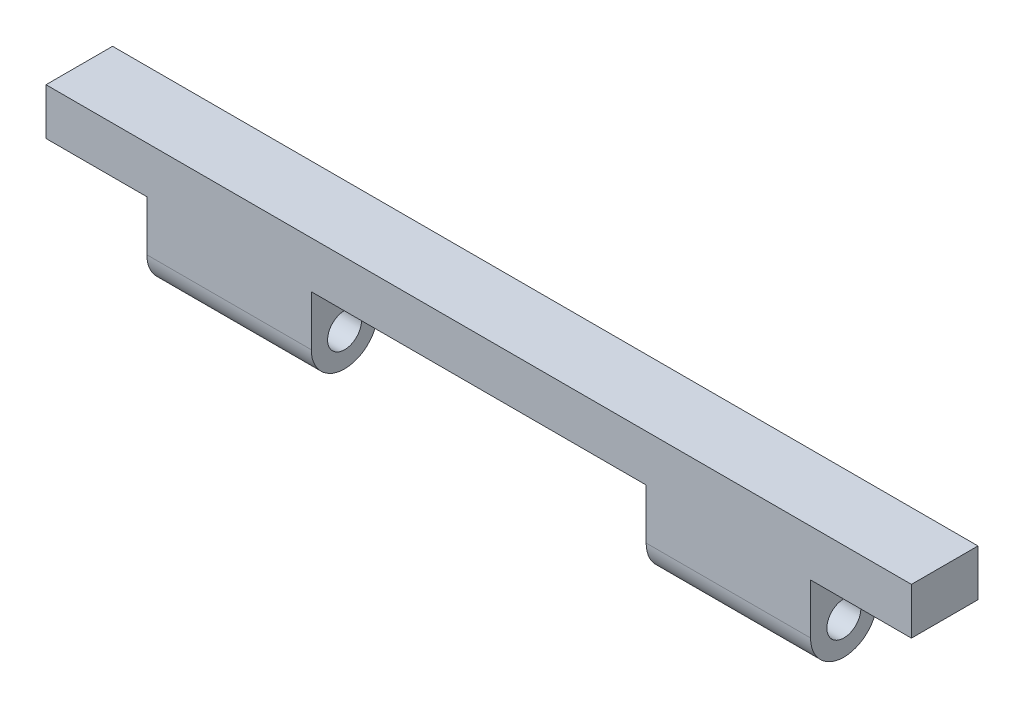
ISO-10303-21;
HEADER;
FILE_DESCRIPTION(('STEP AP214'),'2;1');
FILE_NAME('part.step','',(''),(''),'','','');
FILE_SCHEMA(('AUTOMOTIVE_DESIGN { 1 0 10303 214 1 1 1 1 }'));
ENDSEC;
DATA;
#1=APPLICATION_CONTEXT('core data for automotive mechanical design processes');
#2=APPLICATION_PROTOCOL_DEFINITION('international standard','automotive_design',2000,#1);
#3=PRODUCT_CONTEXT('',#1,'mechanical');
#4=PRODUCT('Part','Part','',(#3));
#5=PRODUCT_RELATED_PRODUCT_CATEGORY('part','',(#4));
#6=PRODUCT_DEFINITION_FORMATION('','',#4);
#7=PRODUCT_DEFINITION_CONTEXT('part definition',#1,'design');
#8=PRODUCT_DEFINITION('design','',#6,#7);
#9=PRODUCT_DEFINITION_SHAPE('','',#8);
#10=(LENGTH_UNIT() NAMED_UNIT(*) SI_UNIT(.MILLI.,.METRE.));
#11=(NAMED_UNIT(*) PLANE_ANGLE_UNIT() SI_UNIT($,.RADIAN.));
#12=(NAMED_UNIT(*) SI_UNIT($,.STERADIAN.) SOLID_ANGLE_UNIT());
#13=UNCERTAINTY_MEASURE_WITH_UNIT(LENGTH_MEASURE(1.E-05),#10,'distance_accuracy_value','');
#14=(GEOMETRIC_REPRESENTATION_CONTEXT(3) GLOBAL_UNCERTAINTY_ASSIGNED_CONTEXT((#13)) GLOBAL_UNIT_ASSIGNED_CONTEXT((#10,
#11,#12)) REPRESENTATION_CONTEXT('',''));
#15=CARTESIAN_POINT('',(0.,0.,0.));
#16=DIRECTION('',(0.,0.,1.));
#17=DIRECTION('',(1.,0.,0.));
#18=AXIS2_PLACEMENT_3D('',#15,#16,#17);
#19=CARTESIAN_POINT('',(25.15,0.,5.));
#20=DIRECTION('',(-1.,0.,0.));
#21=DIRECTION('',(0.,0.,1.));
#22=AXIS2_PLACEMENT_3D('',#19,#20,#21);
#23=PLANE('',#22);
#24=CARTESIAN_POINT('',(25.15,-5.95,0.));
#25=DIRECTION('',(-1.,0.,0.));
#26=DIRECTION('',(0.,0.,1.));
#27=AXIS2_PLACEMENT_3D('',#24,#25,#26);
#28=CIRCLE('',#27,2.55);
#29=CARTESIAN_POINT('',(25.15,-5.95,2.55));
#30=VERTEX_POINT('',#29);
#31=EDGE_CURVE('E186',#30,#30,#28,.T.);
#32=ORIENTED_EDGE('',*,*,#31,.F.);
#33=EDGE_LOOP('',(#32));
#34=FACE_BOUND('',#33,.T.);
#35=CARTESIAN_POINT('',(25.15,-6.,0.));
#36=DIRECTION('',(-1.,0.,0.));
#37=DIRECTION('',(0.,0.,1.));
#38=AXIS2_PLACEMENT_3D('',#35,#36,#37);
#39=CIRCLE('',#38,5.);
#40=CARTESIAN_POINT('',(25.15,-6.,-5.));
#41=VERTEX_POINT('',#40);
#42=CARTESIAN_POINT('',(25.15,-11.,0.));
#43=VERTEX_POINT('',#42);
#44=EDGE_CURVE('E53',#41,#43,#39,.T.);
#45=ORIENTED_EDGE('',*,*,#44,.T.);
#46=CARTESIAN_POINT('',(25.15,-6.,0.));
#47=DIRECTION('',(-1.,0.,0.));
#48=DIRECTION('',(0.,0.,1.));
#49=AXIS2_PLACEMENT_3D('',#46,#47,#48);
#50=CIRCLE('',#49,5.);
#51=CARTESIAN_POINT('',(25.15,-6.,5.));
#52=VERTEX_POINT('',#51);
#53=EDGE_CURVE('E246',#43,#52,#50,.T.);
#54=ORIENTED_EDGE('',*,*,#53,.T.);
#55=DIRECTION('',(0.,1.,0.));
#56=VECTOR('',#55,1.);
#57=CARTESIAN_POINT('',(25.15,0.,5.));
#58=LINE('',#57,#56);
#59=CARTESIAN_POINT('',(25.15,1.55,5.));
#60=VERTEX_POINT('',#59);
#61=EDGE_CURVE('E149',#52,#60,#58,.T.);
#62=ORIENTED_EDGE('',*,*,#61,.T.);
#63=DIRECTION('',(0.,0.,-1.));
#64=VECTOR('',#63,1.);
#65=CARTESIAN_POINT('',(25.15,1.55,5.));
#66=LINE('',#65,#64);
#67=CARTESIAN_POINT('',(25.15,1.55,-5.));
#68=VERTEX_POINT('',#67);
#69=EDGE_CURVE('E183',#60,#68,#66,.T.);
#70=ORIENTED_EDGE('',*,*,#69,.T.);
#71=DIRECTION('',(0.,1.,0.));
#72=VECTOR('',#71,1.);
#73=CARTESIAN_POINT('',(25.15,0.,-5.));
#74=LINE('',#73,#72);
#75=EDGE_CURVE('E184',#41,#68,#74,.T.);
#76=ORIENTED_EDGE('',*,*,#75,.F.);
#77=EDGE_LOOP('',(#45,#54,#62,#70,#76));
#78=FACE_BOUND('',#77,.T.);
#79=ADVANCED_FACE('F36',(#34,#78),#23,.T.);
#80=CARTESIAN_POINT('',(49.85,0.,5.));
#81=DIRECTION('',(-1.,0.,0.));
#82=DIRECTION('',(0.,0.,1.));
#83=AXIS2_PLACEMENT_3D('',#80,#81,#82);
#84=PLANE('',#83);
#85=CARTESIAN_POINT('',(49.85,-5.95,0.));
#86=DIRECTION('',(-1.,0.,0.));
#87=DIRECTION('',(0.,0.,1.));
#88=AXIS2_PLACEMENT_3D('',#85,#86,#87);
#89=CIRCLE('',#88,2.55);
#90=CARTESIAN_POINT('',(49.85,-5.95,2.55));
#91=VERTEX_POINT('',#90);
#92=EDGE_CURVE('E474',#91,#91,#89,.T.);
#93=ORIENTED_EDGE('',*,*,#92,.T.);
#94=EDGE_LOOP('',(#93));
#95=FACE_BOUND('',#94,.T.);
#96=DIRECTION('',(0.,1.,0.));
#97=VECTOR('',#96,1.);
#98=CARTESIAN_POINT('',(49.85,0.,5.));
#99=LINE('',#98,#97);
#100=CARTESIAN_POINT('',(49.85,-6.,5.));
#101=VERTEX_POINT('',#100);
#102=CARTESIAN_POINT('',(49.85,1.55,5.));
#103=VERTEX_POINT('',#102);
#104=EDGE_CURVE('E139',#101,#103,#99,.T.);
#105=ORIENTED_EDGE('',*,*,#104,.F.);
#106=CARTESIAN_POINT('',(49.85,-6.,0.));
#107=DIRECTION('',(-1.,0.,0.));
#108=DIRECTION('',(0.,0.,1.));
#109=AXIS2_PLACEMENT_3D('',#106,#107,#108);
#110=CIRCLE('',#109,5.);
#111=CARTESIAN_POINT('',(49.85,-11.,0.));
#112=VERTEX_POINT('',#111);
#113=EDGE_CURVE('E243',#101,#112,#110,.F.);
#114=ORIENTED_EDGE('',*,*,#113,.T.);
#115=CARTESIAN_POINT('',(49.85,-6.,0.));
#116=DIRECTION('',(-1.,0.,0.));
#117=DIRECTION('',(0.,0.,1.));
#118=AXIS2_PLACEMENT_3D('',#115,#116,#117);
#119=CIRCLE('',#118,5.);
#120=CARTESIAN_POINT('',(49.85,-6.,-5.));
#121=VERTEX_POINT('',#120);
#122=EDGE_CURVE('E241',#112,#121,#119,.F.);
#123=ORIENTED_EDGE('',*,*,#122,.T.);
#124=DIRECTION('',(0.,1.,0.));
#125=VECTOR('',#124,1.);
#126=CARTESIAN_POINT('',(49.85,0.,-5.));
#127=LINE('',#126,#125);
#128=CARTESIAN_POINT('',(49.85,1.55,-5.));
#129=VERTEX_POINT('',#128);
#130=EDGE_CURVE('E154',#121,#129,#127,.T.);
#131=ORIENTED_EDGE('',*,*,#130,.T.);
#132=DIRECTION('',(0.,0.,-1.));
#133=VECTOR('',#132,1.);
#134=CARTESIAN_POINT('',(49.85,1.55,5.));
#135=LINE('',#134,#133);
#136=EDGE_CURVE('E152',#103,#129,#135,.T.);
#137=ORIENTED_EDGE('',*,*,#136,.F.);
#138=EDGE_LOOP('',(#105,#114,#123,#131,#137));
#139=FACE_BOUND('',#138,.T.);
#140=ADVANCED_FACE('F153',(#95,#139),#84,.F.);
#141=CARTESIAN_POINT('',(0.,1.55,5.));
#142=DIRECTION('',(0.,-1.,0.));
#143=DIRECTION('',(0.,0.,-1.));
#144=AXIS2_PLACEMENT_3D('',#141,#142,#143);
#145=PLANE('',#144);
#146=DIRECTION('',(-1.,0.,0.));
#147=VECTOR('',#146,1.);
#148=CARTESIAN_POINT('',(0.,1.55,-5.));
#149=LINE('',#148,#147);
#150=CARTESIAN_POINT('',(65.,1.55,-5.));
#151=VERTEX_POINT('',#150);
#152=EDGE_CURVE('E188',#151,#129,#149,.T.);
#153=ORIENTED_EDGE('',*,*,#152,.F.);
#154=DIRECTION('',(0.,0.,-1.));
#155=VECTOR('',#154,1.);
#156=CARTESIAN_POINT('',(65.,1.55,5.));
#157=LINE('',#156,#155);
#158=CARTESIAN_POINT('',(65.,1.55,5.));
#159=VERTEX_POINT('',#158);
#160=EDGE_CURVE('E158',#159,#151,#157,.T.);
#161=ORIENTED_EDGE('',*,*,#160,.F.);
#162=DIRECTION('',(-1.,0.,0.));
#163=VECTOR('',#162,1.);
#164=CARTESIAN_POINT('',(0.,1.55,5.));
#165=LINE('',#164,#163);
#166=EDGE_CURVE('E144',#159,#103,#165,.T.);
#167=ORIENTED_EDGE('',*,*,#166,.T.);
#168=ORIENTED_EDGE('',*,*,#136,.T.);
#169=EDGE_LOOP('',(#153,#161,#167,#168));
#170=FACE_BOUND('',#169,.T.);
#171=ADVANCED_FACE('F160',(#170),#145,.T.);
#172=CARTESIAN_POINT('',(65.,0.,5.));
#173=DIRECTION('',(-1.,0.,0.));
#174=DIRECTION('',(0.,0.,1.));
#175=AXIS2_PLACEMENT_3D('',#172,#173,#174);
#176=PLANE('',#175);
#177=DIRECTION('',(0.,1.,0.));
#178=VECTOR('',#177,1.);
#179=CARTESIAN_POINT('',(65.,0.,-5.));
#180=LINE('',#179,#178);
#181=CARTESIAN_POINT('',(65.,8.55,-5.));
#182=VERTEX_POINT('',#181);
#183=EDGE_CURVE('E190',#151,#182,#180,.T.);
#184=ORIENTED_EDGE('',*,*,#183,.T.);
#185=DIRECTION('',(0.,0.,-1.));
#186=VECTOR('',#185,1.);
#187=CARTESIAN_POINT('',(65.,8.55,5.));
#188=LINE('',#187,#186);
#189=CARTESIAN_POINT('',(65.,8.55,5.));
#190=VERTEX_POINT('',#189);
#191=EDGE_CURVE('E221',#190,#182,#188,.T.);
#192=ORIENTED_EDGE('',*,*,#191,.F.);
#193=DIRECTION('',(0.,1.,0.));
#194=VECTOR('',#193,1.);
#195=CARTESIAN_POINT('',(65.,0.,5.));
#196=LINE('',#195,#194);
#197=EDGE_CURVE('E162',#159,#190,#196,.T.);
#198=ORIENTED_EDGE('',*,*,#197,.F.);
#199=ORIENTED_EDGE('',*,*,#160,.T.);
#200=EDGE_LOOP('',(#184,#192,#198,#199));
#201=FACE_BOUND('',#200,.T.);
#202=ADVANCED_FACE('F264',(#201),#176,.F.);
#203=CARTESIAN_POINT('',(0.,8.55,5.));
#204=DIRECTION('',(0.,1.,0.));
#205=DIRECTION('',(0.,0.,1.));
#206=AXIS2_PLACEMENT_3D('',#203,#204,#205);
#207=PLANE('',#206);
#208=DIRECTION('',(1.,0.,0.));
#209=VECTOR('',#208,1.);
#210=CARTESIAN_POINT('',(0.,8.55,-5.));
#211=LINE('',#210,#209);
#212=CARTESIAN_POINT('',(-65.,8.55,-5.));
#213=VERTEX_POINT('',#212);
#214=EDGE_CURVE('E193',#213,#182,#211,.T.);
#215=ORIENTED_EDGE('',*,*,#214,.F.);
#216=DIRECTION('',(0.,0.,-1.));
#217=VECTOR('',#216,1.);
#218=CARTESIAN_POINT('',(-65.,8.55,5.));
#219=LINE('',#218,#217);
#220=CARTESIAN_POINT('',(-65.,8.55,5.));
#221=VERTEX_POINT('',#220);
#222=EDGE_CURVE('E219',#221,#213,#219,.T.);
#223=ORIENTED_EDGE('',*,*,#222,.F.);
#224=DIRECTION('',(1.,0.,0.));
#225=VECTOR('',#224,1.);
#226=CARTESIAN_POINT('',(0.,8.55,5.));
#227=LINE('',#226,#225);
#228=EDGE_CURVE('E164',#221,#190,#227,.T.);
#229=ORIENTED_EDGE('',*,*,#228,.T.);
#230=ORIENTED_EDGE('',*,*,#191,.T.);
#231=EDGE_LOOP('',(#215,#223,#229,#230));
#232=FACE_BOUND('',#231,.T.);
#233=ADVANCED_FACE('F402',(#232),#207,.T.);
#234=CARTESIAN_POINT('',(-65.,0.,5.));
#235=DIRECTION('',(-1.,0.,0.));
#236=DIRECTION('',(0.,0.,1.));
#237=AXIS2_PLACEMENT_3D('',#234,#235,#236);
#238=PLANE('',#237);
#239=DIRECTION('',(0.,1.,0.));
#240=VECTOR('',#239,1.);
#241=CARTESIAN_POINT('',(-65.,0.,-5.));
#242=LINE('',#241,#240);
#243=CARTESIAN_POINT('',(-65.,1.55,-5.));
#244=VERTEX_POINT('',#243);
#245=EDGE_CURVE('E196',#244,#213,#242,.T.);
#246=ORIENTED_EDGE('',*,*,#245,.F.);
#247=DIRECTION('',(0.,0.,-1.));
#248=VECTOR('',#247,1.);
#249=CARTESIAN_POINT('',(-65.,1.55,5.));
#250=LINE('',#249,#248);
#251=CARTESIAN_POINT('',(-65.,1.55,5.));
#252=VERTEX_POINT('',#251);
#253=EDGE_CURVE('E217',#252,#244,#250,.T.);
#254=ORIENTED_EDGE('',*,*,#253,.F.);
#255=DIRECTION('',(0.,1.,0.));
#256=VECTOR('',#255,1.);
#257=CARTESIAN_POINT('',(-65.,0.,5.));
#258=LINE('',#257,#256);
#259=EDGE_CURVE('E170',#252,#221,#258,.T.);
#260=ORIENTED_EDGE('',*,*,#259,.T.);
#261=ORIENTED_EDGE('',*,*,#222,.T.);
#262=EDGE_LOOP('',(#246,#254,#260,#261));
#263=FACE_BOUND('',#262,.T.);
#264=ADVANCED_FACE('F271',(#263),#238,.T.);
#265=CARTESIAN_POINT('',(0.,1.55000000000001,5.));
#266=DIRECTION('',(0.,-1.,0.));
#267=DIRECTION('',(1.,0.,0.));
#268=AXIS2_PLACEMENT_3D('',#265,#266,#267);
#269=PLANE('',#268);
#270=DIRECTION('',(-1.,0.,0.));
#271=VECTOR('',#270,1.);
#272=CARTESIAN_POINT('',(0.,1.55000000000001,-5.));
#273=LINE('',#272,#271);
#274=CARTESIAN_POINT('',(-49.85,1.55,-5.));
#275=VERTEX_POINT('',#274);
#276=EDGE_CURVE('E199',#275,#244,#273,.T.);
#277=ORIENTED_EDGE('',*,*,#276,.F.);
#278=DIRECTION('',(0.,0.,-1.));
#279=VECTOR('',#278,1.);
#280=CARTESIAN_POINT('',(-49.85,1.55,5.));
#281=LINE('',#280,#279);
#282=CARTESIAN_POINT('',(-49.85,1.55,5.));
#283=VERTEX_POINT('',#282);
#284=EDGE_CURVE('E214',#283,#275,#281,.T.);
#285=ORIENTED_EDGE('',*,*,#284,.F.);
#286=DIRECTION('',(-1.,0.,0.));
#287=VECTOR('',#286,1.);
#288=CARTESIAN_POINT('',(0.,1.55000000000001,5.));
#289=LINE('',#288,#287);
#290=EDGE_CURVE('E173',#283,#252,#289,.T.);
#291=ORIENTED_EDGE('',*,*,#290,.T.);
#292=ORIENTED_EDGE('',*,*,#253,.T.);
#293=EDGE_LOOP('',(#277,#285,#291,#292));
#294=FACE_BOUND('',#293,.T.);
#295=ADVANCED_FACE('F274',(#294),#269,.T.);
#296=CARTESIAN_POINT('',(-49.85,0.,5.));
#297=DIRECTION('',(-1.,0.,0.));
#298=DIRECTION('',(0.,0.,1.));
#299=AXIS2_PLACEMENT_3D('',#296,#297,#298);
#300=PLANE('',#299);
#301=CARTESIAN_POINT('',(-49.85,-5.95,0.));
#302=DIRECTION('',(-1.,0.,0.));
#303=DIRECTION('',(0.,0.,1.));
#304=AXIS2_PLACEMENT_3D('',#301,#302,#303);
#305=CIRCLE('',#304,2.55);
#306=CARTESIAN_POINT('',(-49.85,-5.95,2.55));
#307=VERTEX_POINT('',#306);
#308=EDGE_CURVE('E227',#307,#307,#305,.T.);
#309=ORIENTED_EDGE('',*,*,#308,.F.);
#310=EDGE_LOOP('',(#309));
#311=FACE_BOUND('',#310,.T.);
#312=CARTESIAN_POINT('',(-49.85,-6.,0.));
#313=DIRECTION('',(-1.,0.,0.));
#314=DIRECTION('',(0.,0.,1.));
#315=AXIS2_PLACEMENT_3D('',#312,#313,#314);
#316=CIRCLE('',#315,5.);
#317=CARTESIAN_POINT('',(-49.85,-6.,-5.));
#318=VERTEX_POINT('',#317);
#319=CARTESIAN_POINT('',(-49.85,-11.,0.));
#320=VERTEX_POINT('',#319);
#321=EDGE_CURVE('E237',#318,#320,#316,.T.);
#322=ORIENTED_EDGE('',*,*,#321,.T.);
#323=CARTESIAN_POINT('',(-49.85,-6.,0.));
#324=DIRECTION('',(-1.,0.,0.));
#325=DIRECTION('',(0.,0.,1.));
#326=AXIS2_PLACEMENT_3D('',#323,#324,#325);
#327=CIRCLE('',#326,5.);
#328=CARTESIAN_POINT('',(-49.85,-6.,5.));
#329=VERTEX_POINT('',#328);
#330=EDGE_CURVE('E239',#320,#329,#327,.T.);
#331=ORIENTED_EDGE('',*,*,#330,.T.);
#332=DIRECTION('',(0.,1.,0.));
#333=VECTOR('',#332,1.);
#334=CARTESIAN_POINT('',(-49.85,0.,5.));
#335=LINE('',#334,#333);
#336=EDGE_CURVE('E176',#329,#283,#335,.T.);
#337=ORIENTED_EDGE('',*,*,#336,.T.);
#338=ORIENTED_EDGE('',*,*,#284,.T.);
#339=DIRECTION('',(0.,1.,0.));
#340=VECTOR('',#339,1.);
#341=CARTESIAN_POINT('',(-49.85,0.,-5.));
#342=LINE('',#341,#340);
#343=EDGE_CURVE('E202',#318,#275,#342,.T.);
#344=ORIENTED_EDGE('',*,*,#343,.F.);
#345=EDGE_LOOP('',(#322,#331,#337,#338,#344));
#346=FACE_BOUND('',#345,.T.);
#347=ADVANCED_FACE('F289',(#311,#346),#300,.T.);
#348=CARTESIAN_POINT('',(-25.15,0.,5.));
#349=DIRECTION('',(-1.,0.,0.));
#350=DIRECTION('',(0.,0.,1.));
#351=AXIS2_PLACEMENT_3D('',#348,#349,#350);
#352=PLANE('',#351);
#353=CARTESIAN_POINT('',(-25.15,-5.95,0.));
#354=DIRECTION('',(-1.,0.,0.));
#355=DIRECTION('',(0.,0.,1.));
#356=AXIS2_PLACEMENT_3D('',#353,#354,#355);
#357=CIRCLE('',#356,2.55);
#358=CARTESIAN_POINT('',(-25.15,-5.95,2.55));
#359=VERTEX_POINT('',#358);
#360=EDGE_CURVE('E224',#359,#359,#357,.T.);
#361=ORIENTED_EDGE('',*,*,#360,.T.);
#362=EDGE_LOOP('',(#361));
#363=FACE_BOUND('',#362,.T.);
#364=DIRECTION('',(0.,1.,0.));
#365=VECTOR('',#364,1.);
#366=CARTESIAN_POINT('',(-25.15,0.,5.));
#367=LINE('',#366,#365);
#368=CARTESIAN_POINT('',(-25.15,-6.,5.));
#369=VERTEX_POINT('',#368);
#370=CARTESIAN_POINT('',(-25.15,1.55,5.));
#371=VERTEX_POINT('',#370);
#372=EDGE_CURVE('E178',#369,#371,#367,.T.);
#373=ORIENTED_EDGE('',*,*,#372,.F.);
#374=CARTESIAN_POINT('',(-25.15,-6.,0.));
#375=DIRECTION('',(-1.,0.,0.));
#376=DIRECTION('',(0.,0.,1.));
#377=AXIS2_PLACEMENT_3D('',#374,#375,#376);
#378=CIRCLE('',#377,5.);
#379=CARTESIAN_POINT('',(-25.15,-11.,0.));
#380=VERTEX_POINT('',#379);
#381=EDGE_CURVE('E235',#369,#380,#378,.F.);
#382=ORIENTED_EDGE('',*,*,#381,.T.);
#383=CARTESIAN_POINT('',(-25.15,-6.,0.));
#384=DIRECTION('',(-1.,0.,0.));
#385=DIRECTION('',(0.,0.,1.));
#386=AXIS2_PLACEMENT_3D('',#383,#384,#385);
#387=CIRCLE('',#386,5.);
#388=CARTESIAN_POINT('',(-25.15,-6.,-5.));
#389=VERTEX_POINT('',#388);
#390=EDGE_CURVE('E233',#380,#389,#387,.F.);
#391=ORIENTED_EDGE('',*,*,#390,.T.);
#392=DIRECTION('',(0.,1.,0.));
#393=VECTOR('',#392,1.);
#394=CARTESIAN_POINT('',(-25.15,0.,-5.));
#395=LINE('',#394,#393);
#396=CARTESIAN_POINT('',(-25.15,1.55,-5.));
#397=VERTEX_POINT('',#396);
#398=EDGE_CURVE('E204',#389,#397,#395,.T.);
#399=ORIENTED_EDGE('',*,*,#398,.T.);
#400=DIRECTION('',(0.,0.,-1.));
#401=VECTOR('',#400,1.);
#402=CARTESIAN_POINT('',(-25.15,1.55,5.));
#403=LINE('',#402,#401);
#404=EDGE_CURVE('E211',#371,#397,#403,.T.);
#405=ORIENTED_EDGE('',*,*,#404,.F.);
#406=EDGE_LOOP('',(#373,#382,#391,#399,#405));
#407=FACE_BOUND('',#406,.T.);
#408=ADVANCED_FACE('F282',(#363,#407),#352,.F.);
#409=CARTESIAN_POINT('',(0.,1.55,5.));
#410=DIRECTION('',(0.,-1.,0.));
#411=DIRECTION('',(0.,0.,-1.));
#412=AXIS2_PLACEMENT_3D('',#409,#410,#411);
#413=PLANE('',#412);
#414=DIRECTION('',(-1.,0.,0.));
#415=VECTOR('',#414,1.);
#416=CARTESIAN_POINT('',(0.,1.55,-5.));
#417=LINE('',#416,#415);
#418=EDGE_CURVE('E206',#68,#397,#417,.T.);
#419=ORIENTED_EDGE('',*,*,#418,.F.);
#420=ORIENTED_EDGE('',*,*,#69,.F.);
#421=DIRECTION('',(-1.,0.,0.));
#422=VECTOR('',#421,1.);
#423=CARTESIAN_POINT('',(0.,1.55,5.));
#424=LINE('',#423,#422);
#425=EDGE_CURVE('E180',#60,#371,#424,.T.);
#426=ORIENTED_EDGE('',*,*,#425,.T.);
#427=ORIENTED_EDGE('',*,*,#404,.T.);
#428=EDGE_LOOP('',(#419,#420,#426,#427));
#429=FACE_BOUND('',#428,.T.);
#430=ADVANCED_FACE('F297',(#429),#413,.T.);
#431=CARTESIAN_POINT('',(0.,0.,5.));
#432=DIRECTION('',(0.,0.,1.));
#433=DIRECTION('',(1.,0.,0.));
#434=AXIS2_PLACEMENT_3D('',#431,#432,#433);
#435=PLANE('',#434);
#436=ORIENTED_EDGE('',*,*,#336,.F.);
#437=DIRECTION('',(1.,0.,0.));
#438=VECTOR('',#437,1.);
#439=CARTESIAN_POINT('',(-25.15,-6.,5.));
#440=LINE('',#439,#438);
#441=EDGE_CURVE('E230',#329,#369,#440,.T.);
#442=ORIENTED_EDGE('',*,*,#441,.T.);
#443=ORIENTED_EDGE('',*,*,#372,.T.);
#444=ORIENTED_EDGE('',*,*,#425,.F.);
#445=ORIENTED_EDGE('',*,*,#61,.F.);
#446=DIRECTION('',(1.,0.,0.));
#447=VECTOR('',#446,1.);
#448=CARTESIAN_POINT('',(49.85,-6.,5.));
#449=LINE('',#448,#447);
#450=EDGE_CURVE('E147',#52,#101,#449,.T.);
#451=ORIENTED_EDGE('',*,*,#450,.T.);
#452=ORIENTED_EDGE('',*,*,#104,.T.);
#453=ORIENTED_EDGE('',*,*,#166,.F.);
#454=ORIENTED_EDGE('',*,*,#197,.T.);
#455=ORIENTED_EDGE('',*,*,#228,.F.);
#456=ORIENTED_EDGE('',*,*,#259,.F.);
#457=ORIENTED_EDGE('',*,*,#290,.F.);
#458=EDGE_LOOP('',(#436,#442,#443,#444,#445,#451,#452,#453,#454,#455,#456,#457));
#459=FACE_BOUND('',#458,.T.);
#460=ADVANCED_FACE('F142',(#459),#435,.T.);
#461=CARTESIAN_POINT('',(0.,0.,-5.));
#462=DIRECTION('',(0.,0.,1.));
#463=DIRECTION('',(1.,0.,0.));
#464=AXIS2_PLACEMENT_3D('',#461,#462,#463);
#465=PLANE('',#464);
#466=ORIENTED_EDGE('',*,*,#398,.F.);
#467=DIRECTION('',(1.,0.,0.));
#468=VECTOR('',#467,1.);
#469=CARTESIAN_POINT('',(0.,-6.,-5.));
#470=LINE('',#469,#468);
#471=EDGE_CURVE('E11',#389,#318,#470,.F.);
#472=ORIENTED_EDGE('',*,*,#471,.T.);
#473=ORIENTED_EDGE('',*,*,#343,.T.);
#474=ORIENTED_EDGE('',*,*,#276,.T.);
#475=ORIENTED_EDGE('',*,*,#245,.T.);
#476=ORIENTED_EDGE('',*,*,#214,.T.);
#477=ORIENTED_EDGE('',*,*,#183,.F.);
#478=ORIENTED_EDGE('',*,*,#152,.T.);
#479=ORIENTED_EDGE('',*,*,#130,.F.);
#480=DIRECTION('',(1.,0.,0.));
#481=VECTOR('',#480,1.);
#482=CARTESIAN_POINT('',(0.,-6.,-5.));
#483=LINE('',#482,#481);
#484=EDGE_CURVE('E45',#121,#41,#483,.F.);
#485=ORIENTED_EDGE('',*,*,#484,.T.);
#486=ORIENTED_EDGE('',*,*,#75,.T.);
#487=ORIENTED_EDGE('',*,*,#418,.T.);
#488=EDGE_LOOP('',(#466,#472,#473,#474,#475,#476,#477,#478,#479,#485,#486,#487));
#489=FACE_BOUND('',#488,.T.);
#490=ADVANCED_FACE('F259',(#489),#465,.F.);
#491=CARTESIAN_POINT('',(65.,-5.95,0.));
#492=DIRECTION('',(-1.,0.,0.));
#493=DIRECTION('',(0.,0.,1.));
#494=AXIS2_PLACEMENT_3D('',#491,#492,#493);
#495=CYLINDRICAL_SURFACE('',#494,2.55);
#496=ORIENTED_EDGE('',*,*,#308,.T.);
#497=EDGE_LOOP('',(#496));
#498=FACE_BOUND('',#497,.T.);
#499=ORIENTED_EDGE('',*,*,#360,.F.);
#500=EDGE_LOOP('',(#499));
#501=FACE_BOUND('',#500,.T.);
#502=ADVANCED_FACE('F338',(#498,#501),#495,.F.);
#503=ORIENTED_EDGE('',*,*,#31,.T.);
#504=EDGE_LOOP('',(#503));
#505=FACE_BOUND('',#504,.T.);
#506=ORIENTED_EDGE('',*,*,#92,.F.);
#507=EDGE_LOOP('',(#506));
#508=FACE_BOUND('',#507,.T.);
#509=ADVANCED_FACE('F316',(#505,#508),#495,.F.);
#510=CARTESIAN_POINT('',(0.,-6.,0.));
#511=DIRECTION('',(1.,0.,0.));
#512=DIRECTION('',(0.,0.,-1.));
#513=AXIS2_PLACEMENT_3D('',#510,#511,#512);
#514=CYLINDRICAL_SURFACE('',#513,5.);
#515=DIRECTION('',(1.,0.,0.));
#516=VECTOR('',#515,1.);
#517=CARTESIAN_POINT('',(0.,-11.,0.));
#518=LINE('',#517,#516);
#519=EDGE_CURVE('E228',#320,#380,#518,.T.);
#520=ORIENTED_EDGE('',*,*,#519,.F.);
#521=ORIENTED_EDGE('',*,*,#321,.F.);
#522=ORIENTED_EDGE('',*,*,#471,.F.);
#523=ORIENTED_EDGE('',*,*,#390,.F.);
#524=EDGE_LOOP('',(#520,#521,#522,#523));
#525=FACE_BOUND('',#524,.T.);
#526=ADVANCED_FACE('F286',(#525),#514,.T.);
#527=CARTESIAN_POINT('',(0.,-6.,0.));
#528=DIRECTION('',(-1.,0.,0.));
#529=DIRECTION('',(0.,0.,1.));
#530=AXIS2_PLACEMENT_3D('',#527,#528,#529);
#531=CYLINDRICAL_SURFACE('',#530,5.);
#532=ORIENTED_EDGE('',*,*,#330,.F.);
#533=ORIENTED_EDGE('',*,*,#519,.T.);
#534=ORIENTED_EDGE('',*,*,#381,.F.);
#535=ORIENTED_EDGE('',*,*,#441,.F.);
#536=EDGE_LOOP('',(#532,#533,#534,#535));
#537=FACE_BOUND('',#536,.T.);
#538=ADVANCED_FACE('F279',(#537),#531,.T.);
#539=CARTESIAN_POINT('',(0.,-6.,0.));
#540=DIRECTION('',(1.,0.,0.));
#541=DIRECTION('',(0.,0.,-1.));
#542=AXIS2_PLACEMENT_3D('',#539,#540,#541);
#543=CYLINDRICAL_SURFACE('',#542,5.);
#544=DIRECTION('',(1.,0.,0.));
#545=VECTOR('',#544,1.);
#546=CARTESIAN_POINT('',(0.,-11.,0.));
#547=LINE('',#546,#545);
#548=EDGE_CURVE('E40',#43,#112,#547,.T.);
#549=ORIENTED_EDGE('',*,*,#548,.F.);
#550=ORIENTED_EDGE('',*,*,#44,.F.);
#551=ORIENTED_EDGE('',*,*,#484,.F.);
#552=ORIENTED_EDGE('',*,*,#122,.F.);
#553=EDGE_LOOP('',(#549,#550,#551,#552));
#554=FACE_BOUND('',#553,.T.);
#555=ADVANCED_FACE('F38',(#554),#543,.T.);
#556=CARTESIAN_POINT('',(0.,-6.,0.));
#557=DIRECTION('',(-1.,0.,0.));
#558=DIRECTION('',(0.,0.,1.));
#559=AXIS2_PLACEMENT_3D('',#556,#557,#558);
#560=CYLINDRICAL_SURFACE('',#559,5.);
#561=ORIENTED_EDGE('',*,*,#53,.F.);
#562=ORIENTED_EDGE('',*,*,#548,.T.);
#563=ORIENTED_EDGE('',*,*,#113,.F.);
#564=ORIENTED_EDGE('',*,*,#450,.F.);
#565=EDGE_LOOP('',(#561,#562,#563,#564));
#566=FACE_BOUND('',#565,.T.);
#567=ADVANCED_FACE('F255',(#566),#560,.T.);
#568=CLOSED_SHELL('',(#79,#140,#171,#202,#233,#264,#295,#347,#408,#430,#460,#490,#502,#509,#526,
#538,#555,#567));
#569=MANIFOLD_SOLID_BREP('B2',#568);
#570=ADVANCED_BREP_SHAPE_REPRESENTATION('',(#18,#569),#14);
#571=SHAPE_DEFINITION_REPRESENTATION(#9,#570);
ENDSEC;
END-ISO-10303-21;
